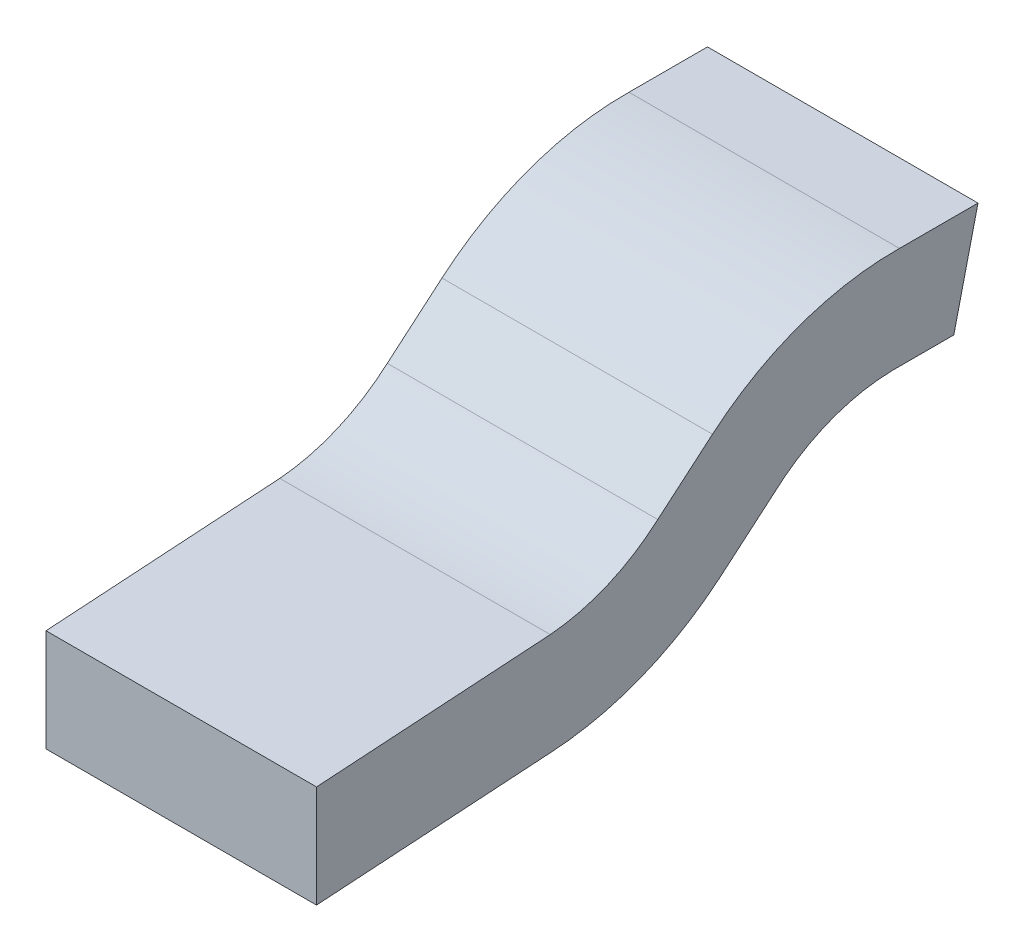
ISO-10303-21;
HEADER;
FILE_DESCRIPTION(('STEP AP214'),'2;1');
FILE_NAME('part.step','',(''),(''),'','','');
FILE_SCHEMA(('AUTOMOTIVE_DESIGN { 1 0 10303 214 1 1 1 1 }'));
ENDSEC;
DATA;
#1=APPLICATION_CONTEXT('core data for automotive mechanical design processes');
#2=APPLICATION_PROTOCOL_DEFINITION('international standard','automotive_design',2000,#1);
#3=PRODUCT_CONTEXT('',#1,'mechanical');
#4=PRODUCT('Part','Part','',(#3));
#5=PRODUCT_RELATED_PRODUCT_CATEGORY('part','',(#4));
#6=PRODUCT_DEFINITION_FORMATION('','',#4);
#7=PRODUCT_DEFINITION_CONTEXT('part definition',#1,'design');
#8=PRODUCT_DEFINITION('design','',#6,#7);
#9=PRODUCT_DEFINITION_SHAPE('','',#8);
#10=(LENGTH_UNIT() NAMED_UNIT(*) SI_UNIT(.MILLI.,.METRE.));
#11=(NAMED_UNIT(*) PLANE_ANGLE_UNIT() SI_UNIT($,.RADIAN.));
#12=(NAMED_UNIT(*) SI_UNIT($,.STERADIAN.) SOLID_ANGLE_UNIT());
#13=UNCERTAINTY_MEASURE_WITH_UNIT(LENGTH_MEASURE(1.E-05),#10,'distance_accuracy_value','');
#14=(GEOMETRIC_REPRESENTATION_CONTEXT(3) GLOBAL_UNCERTAINTY_ASSIGNED_CONTEXT((#13)) GLOBAL_UNIT_ASSIGNED_CONTEXT((#10,
#11,#12)) REPRESENTATION_CONTEXT('',''));
#15=CARTESIAN_POINT('',(0.,0.,0.));
#16=DIRECTION('',(0.,0.,1.));
#17=DIRECTION('',(1.,0.,0.));
#18=AXIS2_PLACEMENT_3D('',#15,#16,#17);
#19=CARTESIAN_POINT('',(-2.67,-0.21911513416,1.58959157295));
#20=DIRECTION('',(-1.,0.,0.));
#21=DIRECTION('',(0.,1.,0.));
#22=AXIS2_PLACEMENT_3D('',#19,#20,#21);
#23=PLANE('',#22);
#24=CARTESIAN_POINT('',(-2.67,-0.856134104349004,1.903958845955));
#25=DIRECTION('',(1.,0.,0.));
#26=DIRECTION('',(0.,0.936329177569152,0.351123441588105));
#27=AXIS2_PLACEMENT_3D('',#24,#25,#26);
#28=CIRCLE('',#27,0.776782196841003);
#29=CARTESIAN_POINT('',(-2.67,-0.07940390005399,1.894971573585));
#30=VERTEX_POINT('',#29);
#31=CARTESIAN_POINT('',(-2.67,-0.263875831851088,2.40649088251571));
#32=VERTEX_POINT('',#31);
#33=EDGE_CURVE('E146',#30,#32,#28,.T.);
#34=ORIENTED_EDGE('',*,*,#33,.F.);
#35=DIRECTION('',(0.,0.,1.));
#36=VECTOR('',#35,1.);
#37=CARTESIAN_POINT('',(-2.67,-0.07940390005399,1.580604300581));
#38=LINE('',#37,#36);
#39=CARTESIAN_POINT('',(-2.67,-0.079403900054,1.680137635818));
#40=VERTEX_POINT('',#39);
#41=EDGE_CURVE('E30',#40,#30,#38,.T.);
#42=ORIENTED_EDGE('',*,*,#41,.F.);
#43=DIRECTION('',(0.,-0.973080287490057,0.230466383879013));
#44=VECTOR('',#43,1.);
#45=CARTESIAN_POINT('',(-2.67,-0.630185003499,1.810585791897));
#46=LINE('',#45,#44);
#47=CARTESIAN_POINT('',(-2.67,-0.358826368266,1.746316641447));
#48=VERTEX_POINT('',#47);
#49=EDGE_CURVE('E11',#40,#48,#46,.T.);
#50=ORIENTED_EDGE('',*,*,#49,.T.);
#51=DIRECTION('',(0.,0.,-1.));
#52=VECTOR('',#51,1.);
#53=CARTESIAN_POINT('',(-2.67,-0.358826368266,1.59857884532));
#54=LINE('',#53,#52);
#55=CARTESIAN_POINT('',(-2.67,-0.358826368266,1.912946118324));
#56=VERTEX_POINT('',#55);
#57=EDGE_CURVE('E239',#56,#48,#54,.T.);
#58=ORIENTED_EDGE('',*,*,#57,.F.);
#59=CARTESIAN_POINT('',(-2.67,-0.856134104348996,1.903958845955));
#60=DIRECTION('',(1.,0.,0.));
#61=DIRECTION('',(0.,0.738961988180257,0.67374711875056));
#62=AXIS2_PLACEMENT_3D('',#59,#60,#61);
#63=CIRCLE('',#62,0.497388937787997);
#64=CARTESIAN_POINT('',(-2.67,-0.488521483012,2.2391289202));
#65=VERTEX_POINT('',#64);
#66=EDGE_CURVE('E226',#56,#65,#63,.T.);
#67=ORIENTED_EDGE('',*,*,#66,.T.);
#68=DIRECTION('',(0.,0.647648420096034,-0.76193931775904));
#69=VECTOR('',#68,1.);
#70=CARTESIAN_POINT('',(-2.67,-0.48846038004,2.239184630712));
#71=LINE('',#70,#69);
#72=CARTESIAN_POINT('',(-2.67,-0.615614851585,2.388778126647));
#73=VERTEX_POINT('',#72);
#74=EDGE_CURVE('E236',#73,#65,#71,.T.);
#75=ORIENTED_EDGE('',*,*,#74,.F.);
#76=CARTESIAN_POINT('',(-2.67,-0.0079498225066503,2.893498141348));
#77=DIRECTION('',(1.,0.,0.));
#78=DIRECTION('',(0.,-0.926566511782982,-0.376130960228371));
#79=AXIS2_PLACEMENT_3D('',#76,#77,#78);
#80=CIRCLE('',#79,0.789936124508996);
#81=CARTESIAN_POINT('',(-2.67,-0.796685529020837,2.85013723881213));
#82=VERTEX_POINT('',#81);
#83=EDGE_CURVE('E296',#82,#73,#80,.T.);
#84=ORIENTED_EDGE('',*,*,#83,.F.);
#85=DIRECTION('',(0.,0.0641948026383885,-0.997937386469822));
#86=VECTOR('',#85,1.);
#87=CARTESIAN_POINT('',(-2.67,-0.796676109769,2.850137707743));
#88=LINE('',#87,#86);
#89=CARTESIAN_POINT('',(-2.67,-0.837814321152,3.489649902865));
#90=VERTEX_POINT('',#89);
#91=EDGE_CURVE('E303',#90,#82,#88,.T.);
#92=ORIENTED_EDGE('',*,*,#91,.F.);
#93=DIRECTION('',(0.,-1.,0.));
#94=VECTOR('',#93,1.);
#95=CARTESIAN_POINT('',(-2.67,-0.697814321152,3.489649902865));
#96=LINE('',#95,#94);
#97=CARTESIAN_POINT('',(-2.67,-0.557814321152,3.489649902865));
#98=VERTEX_POINT('',#97);
#99=EDGE_CURVE('E310',#98,#90,#96,.T.);
#100=ORIENTED_EDGE('',*,*,#99,.F.);
#101=DIRECTION('',(0.,-0.0641948026383885,0.997937386469822));
#102=VECTOR('',#101,1.);
#103=CARTESIAN_POINT('',(-2.67,-0.516676109769,2.850137707743));
#104=LINE('',#103,#102);
#105=CARTESIAN_POINT('',(-2.67,-0.516661571834,2.85013894686));
#106=VERTEX_POINT('',#105);
#107=EDGE_CURVE('E338',#106,#98,#104,.T.);
#108=ORIENTED_EDGE('',*,*,#107,.F.);
#109=CARTESIAN_POINT('',(-2.67,-0.0079498225066469,2.893498141348));
#110=DIRECTION('',(1.,0.,0.));
#111=DIRECTION('',(0.,-0.750420434887289,-0.660960793771894));
#112=AXIS2_PLACEMENT_3D('',#109,#110,#111);
#113=CIRCLE('',#112,0.510541639018999);
#114=CARTESIAN_POINT('',(-2.67,-0.391070701287,2.556050134368));
#115=VERTEX_POINT('',#114);
#116=EDGE_CURVE('E316',#106,#115,#113,.T.);
#117=ORIENTED_EDGE('',*,*,#116,.T.);
#118=DIRECTION('',(0.,-0.647648420096034,0.76193931775904));
#119=VECTOR('',#118,1.);
#120=CARTESIAN_POINT('',(-2.67,-0.263916229743,2.406456638433));
#121=LINE('',#120,#119);
#122=EDGE_CURVE('E151',#32,#115,#121,.T.);
#123=ORIENTED_EDGE('',*,*,#122,.F.);
#124=EDGE_LOOP('',(#34,#42,#50,#58,#67,#75,#84,#92,#100,#108,#117,#123));
#125=FACE_BOUND('',#124,.T.);
#126=ADVANCED_FACE('F17',(#125),#23,.T.);
#127=CARTESIAN_POINT('',(-2.3,-0.630185003499,1.810585791897));
#128=DIRECTION('',(0.,0.230466383879013,0.973080287490057));
#129=DIRECTION('',(1.,4.08208510380904E-13,0.));
#130=AXIS2_PLACEMENT_3D('',#127,#128,#129);
#131=PLANE('',#130);
#132=DIRECTION('',(-1.,0.,0.));
#133=VECTOR('',#132,1.);
#134=CARTESIAN_POINT('',(-2.3,-0.07940390005399,1.680137635818));
#135=LINE('',#134,#133);
#136=CARTESIAN_POINT('',(-1.93,-0.07940390005399,1.680137635818));
#137=VERTEX_POINT('',#136);
#138=EDGE_CURVE('E320',#137,#40,#135,.T.);
#139=ORIENTED_EDGE('',*,*,#138,.F.);
#140=DIRECTION('',(0.,0.973080287490057,-0.230466383879013));
#141=VECTOR('',#140,1.);
#142=CARTESIAN_POINT('',(-1.93,-0.358826368266,1.746316641447));
#143=LINE('',#142,#141);
#144=CARTESIAN_POINT('',(-1.93,-0.358826368266,1.746316641447));
#145=VERTEX_POINT('',#144);
#146=EDGE_CURVE('E176',#145,#137,#143,.T.);
#147=ORIENTED_EDGE('',*,*,#146,.F.);
#148=DIRECTION('',(1.,0.,0.));
#149=VECTOR('',#148,1.);
#150=CARTESIAN_POINT('',(-2.3,-0.358826368266,1.746316641447));
#151=LINE('',#150,#149);
#152=EDGE_CURVE('E242',#48,#145,#151,.T.);
#153=ORIENTED_EDGE('',*,*,#152,.F.);
#154=ORIENTED_EDGE('',*,*,#49,.F.);
#155=EDGE_LOOP('',(#139,#147,#153,#154));
#156=FACE_BOUND('',#155,.T.);
#157=ADVANCED_FACE('F406',(#156),#131,.F.);
#158=CARTESIAN_POINT('',(-2.3,-0.07940390005399,1.580604300581));
#159=DIRECTION('',(0.,1.,0.));
#160=DIRECTION('',(1.,0.,0.));
#161=AXIS2_PLACEMENT_3D('',#158,#159,#160);
#162=PLANE('',#161);
#163=DIRECTION('',(-1.,0.,0.));
#164=VECTOR('',#163,1.);
#165=CARTESIAN_POINT('',(-2.3,-0.07940390005399,1.894971573585));
#166=LINE('',#165,#164);
#167=CARTESIAN_POINT('',(-1.93,-0.07940390005399,1.894971573585));
#168=VERTEX_POINT('',#167);
#169=EDGE_CURVE('E317',#168,#30,#166,.T.);
#170=ORIENTED_EDGE('',*,*,#169,.F.);
#171=DIRECTION('',(0.,0.,1.));
#172=VECTOR('',#171,1.);
#173=CARTESIAN_POINT('',(-1.93,-0.07940390005399,1.58959157295));
#174=LINE('',#173,#172);
#175=EDGE_CURVE('E169',#137,#168,#174,.T.);
#176=ORIENTED_EDGE('',*,*,#175,.F.);
#177=ORIENTED_EDGE('',*,*,#138,.T.);
#178=ORIENTED_EDGE('',*,*,#41,.T.);
#179=EDGE_LOOP('',(#170,#176,#177,#178));
#180=FACE_BOUND('',#179,.T.);
#181=ADVANCED_FACE('F383',(#180),#162,.T.);
#182=CARTESIAN_POINT('',(-2.3,-0.856134104349,1.903958845955));
#183=DIRECTION('',(-1.,0.,0.));
#184=DIRECTION('',(0.,0.,1.));
#185=AXIS2_PLACEMENT_3D('',#182,#183,#184);
#186=CYLINDRICAL_SURFACE('',#185,0.776782196841);
#187=CARTESIAN_POINT('',(-1.93,-0.263916199883721,2.40645660330444));
#188=DIRECTION('',(-1.,0.,0.));
#189=VECTOR('',#188,1.);
#190=LINE('',#187,#189);
#191=CARTESIAN_POINT('',(-1.93,-0.263875831851088,2.40649088251571));
#192=VERTEX_POINT('',#191);
#193=EDGE_CURVE('E139',#192,#32,#190,.T.);
#194=ORIENTED_EDGE('',*,*,#193,.F.);
#195=CARTESIAN_POINT('',(-1.93,-0.856134104349,1.903958845955));
#196=DIRECTION('',(1.,0.,0.));
#197=DIRECTION('',(0.,0.,1.));
#198=AXIS2_PLACEMENT_3D('',#195,#196,#197);
#199=CIRCLE('',#198,0.776782196841);
#200=EDGE_CURVE('E144',#168,#192,#199,.T.);
#201=ORIENTED_EDGE('',*,*,#200,.F.);
#202=ORIENTED_EDGE('',*,*,#169,.T.);
#203=ORIENTED_EDGE('',*,*,#33,.T.);
#204=EDGE_LOOP('',(#194,#201,#202,#203));
#205=FACE_BOUND('',#204,.T.);
#206=ADVANCED_FACE('F19',(#205),#186,.T.);
#207=CARTESIAN_POINT('',(-2.3,-0.263916229743,2.406456638433));
#208=DIRECTION('',(0.,0.76193931775904,0.647648420096034));
#209=DIRECTION('',(1.,0.,0.));
#210=AXIS2_PLACEMENT_3D('',#207,#208,#209);
#211=PLANE('',#210);
#212=ORIENTED_EDGE('',*,*,#193,.T.);
#213=ORIENTED_EDGE('',*,*,#122,.T.);
#214=DIRECTION('',(1.,0.,0.));
#215=VECTOR('',#214,1.);
#216=CARTESIAN_POINT('',(-2.3,-0.391070701287,2.556050134368));
#217=LINE('',#216,#215);
#218=CARTESIAN_POINT('',(-1.93,-0.391070701287,2.556050134368));
#219=VERTEX_POINT('',#218);
#220=EDGE_CURVE('E152',#115,#219,#217,.T.);
#221=ORIENTED_EDGE('',*,*,#220,.T.);
#222=DIRECTION('',(0.,-0.647648420096034,0.76193931775904));
#223=VECTOR('',#222,1.);
#224=CARTESIAN_POINT('',(-1.93,-0.263916229743,2.406456638433));
#225=LINE('',#224,#223);
#226=EDGE_CURVE('E156',#192,#219,#225,.T.);
#227=ORIENTED_EDGE('',*,*,#226,.F.);
#228=EDGE_LOOP('',(#212,#213,#221,#227));
#229=FACE_BOUND('',#228,.T.);
#230=ADVANCED_FACE('F157',(#229),#211,.T.);
#231=CARTESIAN_POINT('',(-2.3,-0.007949822506646,2.893498141348));
#232=DIRECTION('',(1.,0.,0.));
#233=DIRECTION('',(0.,0.,-1.));
#234=AXIS2_PLACEMENT_3D('',#231,#232,#233);
#235=CYLINDRICAL_SURFACE('',#234,0.510541639019);
#236=ORIENTED_EDGE('',*,*,#116,.F.);
#237=CARTESIAN_POINT('',(-1.93,-0.516676129239368,2.85013801041872));
#238=DIRECTION('',(-1.,0.,0.));
#239=VECTOR('',#238,1.);
#240=LINE('',#237,#239);
#241=CARTESIAN_POINT('',(-1.93,-0.516661720904127,2.85014096168472));
#242=VERTEX_POINT('',#241);
#243=EDGE_CURVE('E313',#242,#106,#240,.T.);
#244=ORIENTED_EDGE('',*,*,#243,.F.);
#245=CARTESIAN_POINT('',(-1.93,-0.007949822506646,2.893498141348));
#246=DIRECTION('',(-1.,0.,0.));
#247=DIRECTION('',(0.,0.,-1.));
#248=AXIS2_PLACEMENT_3D('',#245,#246,#247);
#249=CIRCLE('',#248,0.510541639019);
#250=EDGE_CURVE('E163',#219,#242,#249,.T.);
#251=ORIENTED_EDGE('',*,*,#250,.F.);
#252=ORIENTED_EDGE('',*,*,#220,.F.);
#253=EDGE_LOOP('',(#236,#244,#251,#252));
#254=FACE_BOUND('',#253,.T.);
#255=ADVANCED_FACE('F193',(#254),#235,.F.);
#256=CARTESIAN_POINT('',(-2.3,-0.516676109769,2.850137707743));
#257=DIRECTION('',(0.,0.997937386469822,0.0641948026383885));
#258=DIRECTION('',(1.,0.,0.));
#259=AXIS2_PLACEMENT_3D('',#256,#257,#258);
#260=PLANE('',#259);
#261=ORIENTED_EDGE('',*,*,#243,.T.);
#262=ORIENTED_EDGE('',*,*,#107,.T.);
#263=DIRECTION('',(-1.,0.,0.));
#264=VECTOR('',#263,1.);
#265=CARTESIAN_POINT('',(-2.3,-0.557814321152,3.489649902865));
#266=LINE('',#265,#264);
#267=CARTESIAN_POINT('',(-1.93,-0.557814321152,3.489649902865));
#268=VERTEX_POINT('',#267);
#269=EDGE_CURVE('E306',#268,#98,#266,.T.);
#270=ORIENTED_EDGE('',*,*,#269,.F.);
#271=DIRECTION('',(0.,-0.0641948026383786,0.997937386469822));
#272=VECTOR('',#271,1.);
#273=CARTESIAN_POINT('',(-1.93,-0.516676109769,2.850137707743));
#274=LINE('',#273,#272);
#275=EDGE_CURVE('E284',#242,#268,#274,.T.);
#276=ORIENTED_EDGE('',*,*,#275,.F.);
#277=EDGE_LOOP('',(#261,#262,#270,#276));
#278=FACE_BOUND('',#277,.T.);
#279=ADVANCED_FACE('F370',(#278),#260,.T.);
#280=CARTESIAN_POINT('',(-2.3,-0.697814321152,3.489649902865));
#281=DIRECTION('',(0.,0.,1.));
#282=DIRECTION('',(0.,-1.,0.));
#283=AXIS2_PLACEMENT_3D('',#280,#281,#282);
#284=PLANE('',#283);
#285=DIRECTION('',(0.,-1.,0.));
#286=VECTOR('',#285,1.);
#287=CARTESIAN_POINT('',(-1.93,-0.21911513416,3.489649902865));
#288=LINE('',#287,#286);
#289=CARTESIAN_POINT('',(-1.93,-0.837814321152,3.489649902865));
#290=VERTEX_POINT('',#289);
#291=EDGE_CURVE('E279',#268,#290,#288,.T.);
#292=ORIENTED_EDGE('',*,*,#291,.F.);
#293=ORIENTED_EDGE('',*,*,#269,.T.);
#294=ORIENTED_EDGE('',*,*,#99,.T.);
#295=DIRECTION('',(-1.,0.,0.));
#296=VECTOR('',#295,1.);
#297=CARTESIAN_POINT('',(-2.3,-0.837814321152,3.489649902865));
#298=LINE('',#297,#296);
#299=EDGE_CURVE('E299',#290,#90,#298,.T.);
#300=ORIENTED_EDGE('',*,*,#299,.F.);
#301=EDGE_LOOP('',(#292,#293,#294,#300));
#302=FACE_BOUND('',#301,.T.);
#303=ADVANCED_FACE('F380',(#302),#284,.T.);
#304=CARTESIAN_POINT('',(-2.3,-0.796676109769,2.850137707743));
#305=DIRECTION('',(0.,-0.997937386469822,-0.0641948026383885));
#306=DIRECTION('',(0.,0.0641948026383885,-0.997937386469822));
#307=AXIS2_PLACEMENT_3D('',#304,#305,#306);
#308=PLANE('',#307);
#309=DIRECTION('',(-1.,0.,0.));
#310=VECTOR('',#309,1.);
#311=CARTESIAN_POINT('',(-1.93,-0.796685525978,2.850137190085));
#312=LINE('',#311,#310);
#313=CARTESIAN_POINT('',(-1.93,-0.796685529021135,2.85013723881211));
#314=VERTEX_POINT('',#313);
#315=EDGE_CURVE('E292',#314,#82,#312,.T.);
#316=ORIENTED_EDGE('',*,*,#315,.F.);
#317=DIRECTION('',(0.,0.0641948026383885,-0.997937386469822));
#318=VECTOR('',#317,1.);
#319=CARTESIAN_POINT('',(-1.93,-0.837814321152,3.489649902865));
#320=LINE('',#319,#318);
#321=EDGE_CURVE('E276',#290,#314,#320,.T.);
#322=ORIENTED_EDGE('',*,*,#321,.F.);
#323=ORIENTED_EDGE('',*,*,#299,.T.);
#324=ORIENTED_EDGE('',*,*,#91,.T.);
#325=EDGE_LOOP('',(#316,#322,#323,#324));
#326=FACE_BOUND('',#325,.T.);
#327=ADVANCED_FACE('F205',(#326),#308,.T.);
#328=CARTESIAN_POINT('',(-2.3,-0.007949822506646,2.893498141348));
#329=DIRECTION('',(1.,0.,0.));
#330=DIRECTION('',(0.,0.,-1.));
#331=AXIS2_PLACEMENT_3D('',#328,#329,#330);
#332=CYLINDRICAL_SURFACE('',#331,0.789936124509);
#333=DIRECTION('',(-1.,0.,0.));
#334=VECTOR('',#333,1.);
#335=CARTESIAN_POINT('',(-2.3,-0.615614851585,2.388778126647));
#336=LINE('',#335,#334);
#337=CARTESIAN_POINT('',(-1.93,-0.615614851585,2.388778126647));
#338=VERTEX_POINT('',#337);
#339=EDGE_CURVE('E232',#338,#73,#336,.T.);
#340=ORIENTED_EDGE('',*,*,#339,.F.);
#341=CARTESIAN_POINT('',(-1.93,-0.007949822506646,2.893498141348));
#342=DIRECTION('',(1.,0.,0.));
#343=DIRECTION('',(0.,0.,-1.));
#344=AXIS2_PLACEMENT_3D('',#341,#342,#343);
#345=CIRCLE('',#344,0.789936124509);
#346=EDGE_CURVE('E258',#314,#338,#345,.T.);
#347=ORIENTED_EDGE('',*,*,#346,.F.);
#348=ORIENTED_EDGE('',*,*,#315,.T.);
#349=ORIENTED_EDGE('',*,*,#83,.T.);
#350=EDGE_LOOP('',(#340,#347,#348,#349));
#351=FACE_BOUND('',#350,.T.);
#352=ADVANCED_FACE('F202',(#351),#332,.T.);
#353=CARTESIAN_POINT('',(-2.3,-0.48846038004,2.239184630712));
#354=DIRECTION('',(0.,-0.76193931775904,-0.647648420096034));
#355=DIRECTION('',(0.,0.647648420096034,-0.76193931775904));
#356=AXIS2_PLACEMENT_3D('',#353,#354,#355);
#357=PLANE('',#356);
#358=CARTESIAN_POINT('',(-2.67,-0.488458518189242,2.23918244029934));
#359=DIRECTION('',(1.,0.,0.));
#360=VECTOR('',#359,1.);
#361=LINE('',#358,#360);
#362=CARTESIAN_POINT('',(-1.93,-0.488521483012,2.2391289202));
#363=VERTEX_POINT('',#362);
#364=EDGE_CURVE('E224',#65,#363,#361,.T.);
#365=ORIENTED_EDGE('',*,*,#364,.T.);
#366=DIRECTION('',(0.,0.647648420096034,-0.76193931775904));
#367=VECTOR('',#366,1.);
#368=CARTESIAN_POINT('',(-1.93,-0.615614851585,2.388778126647));
#369=LINE('',#368,#367);
#370=EDGE_CURVE('E254',#338,#363,#369,.T.);
#371=ORIENTED_EDGE('',*,*,#370,.F.);
#372=ORIENTED_EDGE('',*,*,#339,.T.);
#373=ORIENTED_EDGE('',*,*,#74,.T.);
#374=EDGE_LOOP('',(#365,#371,#372,#373));
#375=FACE_BOUND('',#374,.T.);
#376=ADVANCED_FACE('F200',(#375),#357,.T.);
#377=CARTESIAN_POINT('',(-2.3,-0.856134104349,1.903958845955));
#378=DIRECTION('',(-1.,0.,0.));
#379=DIRECTION('',(0.,0.,1.));
#380=AXIS2_PLACEMENT_3D('',#377,#378,#379);
#381=CYLINDRICAL_SURFACE('',#380,0.497388937788);
#382=ORIENTED_EDGE('',*,*,#66,.F.);
#383=DIRECTION('',(-1.,0.,0.));
#384=VECTOR('',#383,1.);
#385=CARTESIAN_POINT('',(-2.3,-0.358826368266,1.912946118324));
#386=LINE('',#385,#384);
#387=CARTESIAN_POINT('',(-1.93,-0.358826368266,1.912946118324));
#388=VERTEX_POINT('',#387);
#389=EDGE_CURVE('E257',#388,#56,#386,.T.);
#390=ORIENTED_EDGE('',*,*,#389,.F.);
#391=CARTESIAN_POINT('',(-1.93,-0.856134104349,1.903958845955));
#392=DIRECTION('',(-1.,0.,0.));
#393=DIRECTION('',(0.,0.,1.));
#394=AXIS2_PLACEMENT_3D('',#391,#392,#393);
#395=CIRCLE('',#394,0.497388937788);
#396=EDGE_CURVE('E228',#363,#388,#395,.T.);
#397=ORIENTED_EDGE('',*,*,#396,.F.);
#398=ORIENTED_EDGE('',*,*,#364,.F.);
#399=EDGE_LOOP('',(#382,#390,#397,#398));
#400=FACE_BOUND('',#399,.T.);
#401=ADVANCED_FACE('F196',(#400),#381,.F.);
#402=CARTESIAN_POINT('',(-2.3,-0.358826368266,1.59857884532));
#403=DIRECTION('',(0.,-1.,0.));
#404=DIRECTION('',(0.,0.,-1.));
#405=AXIS2_PLACEMENT_3D('',#402,#403,#404);
#406=PLANE('',#405);
#407=ORIENTED_EDGE('',*,*,#389,.T.);
#408=ORIENTED_EDGE('',*,*,#57,.T.);
#409=ORIENTED_EDGE('',*,*,#152,.T.);
#410=DIRECTION('',(0.,0.,-1.));
#411=VECTOR('',#410,1.);
#412=CARTESIAN_POINT('',(-1.93,-0.358826368266,1.58959157295));
#413=LINE('',#412,#411);
#414=EDGE_CURVE('E262',#388,#145,#413,.T.);
#415=ORIENTED_EDGE('',*,*,#414,.F.);
#416=EDGE_LOOP('',(#407,#408,#409,#415));
#417=FACE_BOUND('',#416,.T.);
#418=ADVANCED_FACE('F194',(#417),#406,.T.);
#419=CARTESIAN_POINT('',(-1.93,-0.21911513416,1.58959157295));
#420=DIRECTION('',(1.,0.,0.));
#421=DIRECTION('',(0.,0.,-1.));
#422=AXIS2_PLACEMENT_3D('',#419,#420,#421);
#423=PLANE('',#422);
#424=ORIENTED_EDGE('',*,*,#396,.T.);
#425=ORIENTED_EDGE('',*,*,#414,.T.);
#426=ORIENTED_EDGE('',*,*,#146,.T.);
#427=ORIENTED_EDGE('',*,*,#175,.T.);
#428=ORIENTED_EDGE('',*,*,#200,.T.);
#429=ORIENTED_EDGE('',*,*,#226,.T.);
#430=ORIENTED_EDGE('',*,*,#250,.T.);
#431=ORIENTED_EDGE('',*,*,#275,.T.);
#432=ORIENTED_EDGE('',*,*,#291,.T.);
#433=ORIENTED_EDGE('',*,*,#321,.T.);
#434=ORIENTED_EDGE('',*,*,#346,.T.);
#435=ORIENTED_EDGE('',*,*,#370,.T.);
#436=EDGE_LOOP('',(#424,#425,#426,#427,#428,#429,#430,#431,#432,#433,#434,#435));
#437=FACE_BOUND('',#436,.T.);
#438=ADVANCED_FACE('F166',(#437),#423,.T.);
#439=CLOSED_SHELL('',(#126,#157,#181,#206,#230,#255,#279,#303,#327,#352,#376,#401,#418,#438));
#440=MANIFOLD_SOLID_BREP('B1',#439);
#441=ADVANCED_BREP_SHAPE_REPRESENTATION('',(#18,#440),#14);
#442=SHAPE_DEFINITION_REPRESENTATION(#9,#441);
ENDSEC;
END-ISO-10303-21;
